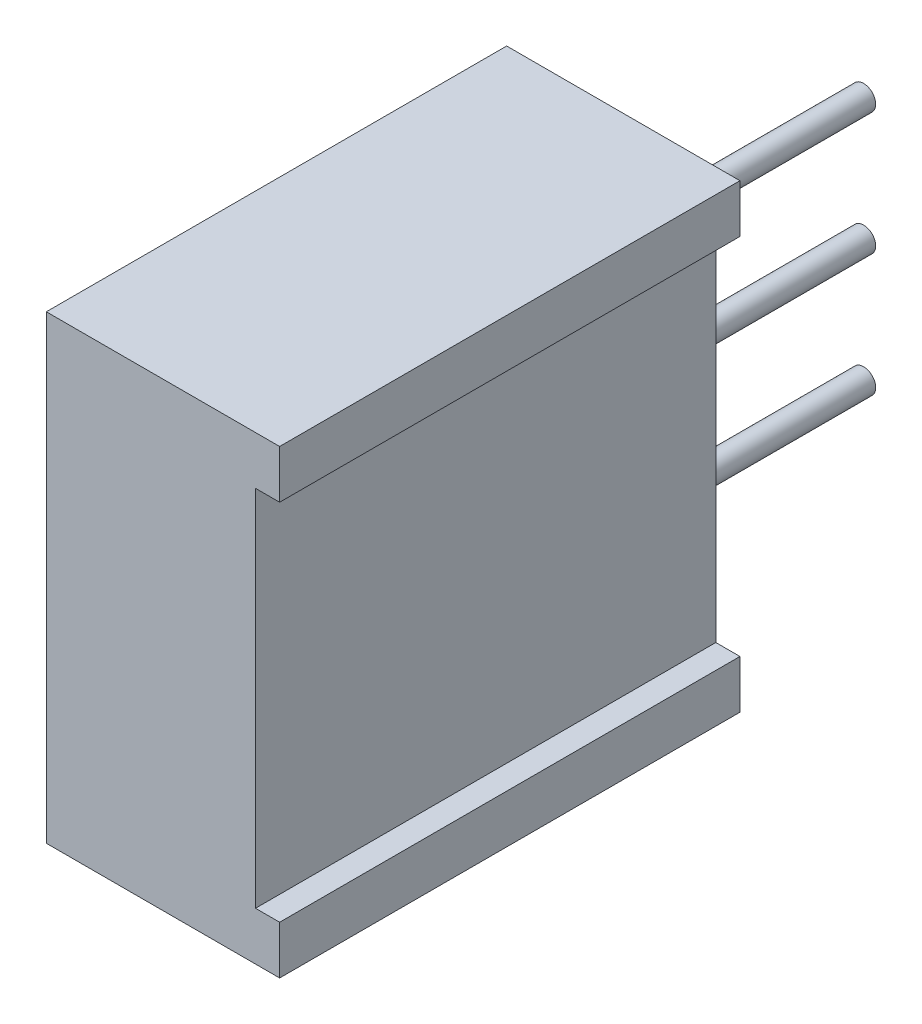
ISO-10303-21;
HEADER;
FILE_DESCRIPTION(('STEP AP214'),'2;1');
FILE_NAME('part.step','',(''),(''),'','','');
FILE_SCHEMA(('AUTOMOTIVE_DESIGN { 1 0 10303 214 1 1 1 1 }'));
ENDSEC;
DATA;
#1=APPLICATION_CONTEXT('core data for automotive mechanical design processes');
#2=APPLICATION_PROTOCOL_DEFINITION('international standard','automotive_design',2000,#1);
#3=PRODUCT_CONTEXT('',#1,'mechanical');
#4=PRODUCT('Part','Part','',(#3));
#5=PRODUCT_RELATED_PRODUCT_CATEGORY('part','',(#4));
#6=PRODUCT_DEFINITION_FORMATION('','',#4);
#7=PRODUCT_DEFINITION_CONTEXT('part definition',#1,'design');
#8=PRODUCT_DEFINITION('design','',#6,#7);
#9=PRODUCT_DEFINITION_SHAPE('','',#8);
#10=(LENGTH_UNIT() NAMED_UNIT(*) SI_UNIT(.MILLI.,.METRE.));
#11=(NAMED_UNIT(*) PLANE_ANGLE_UNIT() SI_UNIT($,.RADIAN.));
#12=(NAMED_UNIT(*) SI_UNIT($,.STERADIAN.) SOLID_ANGLE_UNIT());
#13=UNCERTAINTY_MEASURE_WITH_UNIT(LENGTH_MEASURE(1.E-05),#10,'distance_accuracy_value','');
#14=(GEOMETRIC_REPRESENTATION_CONTEXT(3) GLOBAL_UNCERTAINTY_ASSIGNED_CONTEXT((#13)) GLOBAL_UNIT_ASSIGNED_CONTEXT((#10,
#11,#12)) REPRESENTATION_CONTEXT('',''));
#15=CARTESIAN_POINT('',(0.,0.,0.));
#16=DIRECTION('',(0.,0.,1.));
#17=DIRECTION('',(1.,0.,0.));
#18=AXIS2_PLACEMENT_3D('',#15,#16,#17);
#19=CARTESIAN_POINT('',(4.83,0.,0.));
#20=DIRECTION('',(-1.,0.,0.));
#21=DIRECTION('',(0.,0.,1.));
#22=AXIS2_PLACEMENT_3D('',#19,#20,#21);
#23=PLANE('',#22);
#24=DIRECTION('',(0.,0.,1.));
#25=VECTOR('',#24,1.);
#26=CARTESIAN_POINT('',(4.83,-1.,0.));
#27=LINE('',#26,#25);
#28=CARTESIAN_POINT('',(4.83,-1.,0.));
#29=VERTEX_POINT('',#28);
#30=CARTESIAN_POINT('',(4.83,-1.,9.52999999999999));
#31=VERTEX_POINT('',#30);
#32=EDGE_CURVE('E45',#29,#31,#27,.T.);
#33=ORIENTED_EDGE('',*,*,#32,.F.);
#34=DIRECTION('',(0.,-1.,0.));
#35=VECTOR('',#34,1.);
#36=CARTESIAN_POINT('',(4.83,0.,0.));
#37=LINE('',#36,#35);
#38=CARTESIAN_POINT('',(4.83,0.,0.));
#39=VERTEX_POINT('',#38);
#40=EDGE_CURVE('E163',#39,#29,#37,.T.);
#41=ORIENTED_EDGE('',*,*,#40,.F.);
#42=DIRECTION('',(0.,0.,1.));
#43=VECTOR('',#42,1.);
#44=CARTESIAN_POINT('',(4.83,0.,0.));
#45=LINE('',#44,#43);
#46=CARTESIAN_POINT('',(4.83,0.,9.52999999999999));
#47=VERTEX_POINT('',#46);
#48=EDGE_CURVE('E128',#39,#47,#45,.T.);
#49=ORIENTED_EDGE('',*,*,#48,.T.);
#50=DIRECTION('',(0.,1.,0.));
#51=VECTOR('',#50,1.);
#52=CARTESIAN_POINT('',(4.83,-9.53,9.53));
#53=LINE('',#52,#51);
#54=EDGE_CURVE('E129',#31,#47,#53,.T.);
#55=ORIENTED_EDGE('',*,*,#54,.F.);
#56=EDGE_LOOP('',(#33,#41,#49,#55));
#57=FACE_BOUND('',#56,.T.);
#58=ADVANCED_FACE('F37',(#57),#23,.F.);
#59=CARTESIAN_POINT('',(4.83,0.,0.));
#60=DIRECTION('',(0.,0.,-1.));
#61=DIRECTION('',(-1.,0.,0.));
#62=AXIS2_PLACEMENT_3D('',#59,#60,#61);
#63=PLANE('',#62);
#64=DIRECTION('',(-1.,0.,0.));
#65=VECTOR('',#64,1.);
#66=CARTESIAN_POINT('',(4.83,-8.53,0.));
#67=LINE('',#66,#65);
#68=CARTESIAN_POINT('',(4.83,-8.53,0.));
#69=VERTEX_POINT('',#68);
#70=CARTESIAN_POINT('',(4.33,-8.53,0.));
#71=VERTEX_POINT('',#70);
#72=EDGE_CURVE('E192',#69,#71,#67,.T.);
#73=ORIENTED_EDGE('',*,*,#72,.F.);
#74=CARTESIAN_POINT('',(4.83,-9.53,0.));
#75=VERTEX_POINT('',#74);
#76=EDGE_CURVE('E86',#69,#75,#37,.T.);
#77=ORIENTED_EDGE('',*,*,#76,.T.);
#78=DIRECTION('',(-1.,0.,0.));
#79=VECTOR('',#78,1.);
#80=CARTESIAN_POINT('',(4.83,-9.53,0.));
#81=LINE('',#80,#79);
#82=CARTESIAN_POINT('',(0.,-9.53,0.));
#83=VERTEX_POINT('',#82);
#84=EDGE_CURVE('E132',#75,#83,#81,.T.);
#85=ORIENTED_EDGE('',*,*,#84,.T.);
#86=DIRECTION('',(0.,-1.,0.));
#87=VECTOR('',#86,1.);
#88=CARTESIAN_POINT('',(0.,0.,0.));
#89=LINE('',#88,#87);
#90=CARTESIAN_POINT('',(0.,0.,0.));
#91=VERTEX_POINT('',#90);
#92=EDGE_CURVE('E138',#91,#83,#89,.T.);
#93=ORIENTED_EDGE('',*,*,#92,.F.);
#94=DIRECTION('',(-1.,0.,0.));
#95=VECTOR('',#94,1.);
#96=CARTESIAN_POINT('',(4.83,0.,0.));
#97=LINE('',#96,#95);
#98=EDGE_CURVE('E61',#39,#91,#97,.T.);
#99=ORIENTED_EDGE('',*,*,#98,.F.);
#100=ORIENTED_EDGE('',*,*,#40,.T.);
#101=DIRECTION('',(-1.,0.,0.));
#102=VECTOR('',#101,1.);
#103=CARTESIAN_POINT('',(4.83,-1.,0.));
#104=LINE('',#103,#102);
#105=CARTESIAN_POINT('',(4.33,-1.,0.));
#106=VERTEX_POINT('',#105);
#107=EDGE_CURVE('E52',#29,#106,#104,.T.);
#108=ORIENTED_EDGE('',*,*,#107,.T.);
#109=DIRECTION('',(0.,-1.,0.));
#110=VECTOR('',#109,1.);
#111=CARTESIAN_POINT('',(4.33,0.,0.));
#112=LINE('',#111,#110);
#113=EDGE_CURVE('E187',#106,#71,#112,.T.);
#114=ORIENTED_EDGE('',*,*,#113,.T.);
#115=EDGE_LOOP('',(#73,#77,#85,#93,#99,#100,#108,#114));
#116=FACE_BOUND('',#115,.T.);
#117=CARTESIAN_POINT('',(2.39,-7.30500000000001,0.));
#118=DIRECTION('',(0.,0.,-1.));
#119=DIRECTION('',(-1.,0.,0.));
#120=AXIS2_PLACEMENT_3D('',#117,#118,#119);
#121=CIRCLE('',#120,0.25);
#122=CARTESIAN_POINT('',(2.14,-7.30500000000001,0.));
#123=VERTEX_POINT('',#122);
#124=EDGE_CURVE('E184',#123,#123,#121,.T.);
#125=ORIENTED_EDGE('',*,*,#124,.F.);
#126=EDGE_LOOP('',(#125));
#127=FACE_BOUND('',#126,.T.);
#128=CARTESIAN_POINT('',(2.39,-4.76500000000001,0.));
#129=DIRECTION('',(0.,0.,-1.));
#130=DIRECTION('',(-1.,0.,0.));
#131=AXIS2_PLACEMENT_3D('',#128,#129,#130);
#132=CIRCLE('',#131,0.25);
#133=CARTESIAN_POINT('',(2.14,-4.76500000000001,0.));
#134=VERTEX_POINT('',#133);
#135=EDGE_CURVE('E178',#134,#134,#132,.T.);
#136=ORIENTED_EDGE('',*,*,#135,.F.);
#137=EDGE_LOOP('',(#136));
#138=FACE_BOUND('',#137,.T.);
#139=CARTESIAN_POINT('',(2.39,-2.22500000000001,0.));
#140=DIRECTION('',(0.,0.,-1.));
#141=DIRECTION('',(-1.,0.,0.));
#142=AXIS2_PLACEMENT_3D('',#139,#140,#141);
#143=CIRCLE('',#142,0.25);
#144=CARTESIAN_POINT('',(2.14,-2.22500000000001,0.));
#145=VERTEX_POINT('',#144);
#146=EDGE_CURVE('E172',#145,#145,#143,.T.);
#147=ORIENTED_EDGE('',*,*,#146,.F.);
#148=EDGE_LOOP('',(#147));
#149=FACE_BOUND('',#148,.T.);
#150=ADVANCED_FACE('F39',(#116,#127,#138,#149),#63,.T.);
#151=CARTESIAN_POINT('',(4.83,0.,0.));
#152=DIRECTION('',(0.,-1.,0.));
#153=DIRECTION('',(0.,0.,-1.));
#154=AXIS2_PLACEMENT_3D('',#151,#152,#153);
#155=PLANE('',#154);
#156=DIRECTION('',(0.,0.,1.));
#157=VECTOR('',#156,1.);
#158=CARTESIAN_POINT('',(0.,0.,0.));
#159=LINE('',#158,#157);
#160=CARTESIAN_POINT('',(0.,0.,9.52999999999999));
#161=VERTEX_POINT('',#160);
#162=EDGE_CURVE('E148',#91,#161,#159,.T.);
#163=ORIENTED_EDGE('',*,*,#162,.T.);
#164=DIRECTION('',(-1.,0.,0.));
#165=VECTOR('',#164,1.);
#166=CARTESIAN_POINT('',(4.83,0.,9.52999999999999));
#167=LINE('',#166,#165);
#168=EDGE_CURVE('E151',#47,#161,#167,.T.);
#169=ORIENTED_EDGE('',*,*,#168,.F.);
#170=ORIENTED_EDGE('',*,*,#48,.F.);
#171=ORIENTED_EDGE('',*,*,#98,.T.);
#172=EDGE_LOOP('',(#163,#169,#170,#171));
#173=FACE_BOUND('',#172,.T.);
#174=ADVANCED_FACE('F164',(#173),#155,.F.);
#175=CARTESIAN_POINT('',(4.83,-9.53,9.53));
#176=DIRECTION('',(0.,0.,1.));
#177=DIRECTION('',(0.,-1.,0.));
#178=AXIS2_PLACEMENT_3D('',#175,#176,#177);
#179=PLANE('',#178);
#180=DIRECTION('',(1.,0.,0.));
#181=VECTOR('',#180,1.);
#182=CARTESIAN_POINT('',(4.33,-8.53,9.52999999999999));
#183=LINE('',#182,#181);
#184=CARTESIAN_POINT('',(4.33,-8.53,9.52999999999999));
#185=VERTEX_POINT('',#184);
#186=CARTESIAN_POINT('',(4.83,-8.53,9.52999999999999));
#187=VERTEX_POINT('',#186);
#188=EDGE_CURVE('E110',#185,#187,#183,.T.);
#189=ORIENTED_EDGE('',*,*,#188,.F.);
#190=DIRECTION('',(0.,1.,0.));
#191=VECTOR('',#190,1.);
#192=CARTESIAN_POINT('',(4.33,-8.53,9.52999999999999));
#193=LINE('',#192,#191);
#194=CARTESIAN_POINT('',(4.33,-1.,9.52999999999999));
#195=VERTEX_POINT('',#194);
#196=EDGE_CURVE('E160',#185,#195,#193,.T.);
#197=ORIENTED_EDGE('',*,*,#196,.T.);
#198=DIRECTION('',(1.,0.,0.));
#199=VECTOR('',#198,1.);
#200=CARTESIAN_POINT('',(4.33,-1.,9.52999999999999));
#201=LINE('',#200,#199);
#202=EDGE_CURVE('E118',#195,#31,#201,.T.);
#203=ORIENTED_EDGE('',*,*,#202,.T.);
#204=ORIENTED_EDGE('',*,*,#54,.T.);
#205=ORIENTED_EDGE('',*,*,#168,.T.);
#206=DIRECTION('',(0.,1.,0.));
#207=VECTOR('',#206,1.);
#208=CARTESIAN_POINT('',(0.,-9.53,9.53));
#209=LINE('',#208,#207);
#210=CARTESIAN_POINT('',(0.,-9.53,9.53));
#211=VERTEX_POINT('',#210);
#212=EDGE_CURVE('E145',#211,#161,#209,.T.);
#213=ORIENTED_EDGE('',*,*,#212,.F.);
#214=DIRECTION('',(-1.,0.,0.));
#215=VECTOR('',#214,1.);
#216=CARTESIAN_POINT('',(4.83,-9.53,9.53));
#217=LINE('',#216,#215);
#218=CARTESIAN_POINT('',(4.83,-9.53,9.53));
#219=VERTEX_POINT('',#218);
#220=EDGE_CURVE('E126',#219,#211,#217,.T.);
#221=ORIENTED_EDGE('',*,*,#220,.F.);
#222=EDGE_CURVE('E123',#219,#187,#53,.T.);
#223=ORIENTED_EDGE('',*,*,#222,.T.);
#224=EDGE_LOOP('',(#189,#197,#203,#204,#205,#213,#221,#223));
#225=FACE_BOUND('',#224,.T.);
#226=ADVANCED_FACE('F124',(#225),#179,.T.);
#227=CARTESIAN_POINT('',(4.83,-9.53,9.53));
#228=DIRECTION('',(0.,1.,0.));
#229=DIRECTION('',(0.,0.,1.));
#230=AXIS2_PLACEMENT_3D('',#227,#228,#229);
#231=PLANE('',#230);
#232=DIRECTION('',(0.,0.,-1.));
#233=VECTOR('',#232,1.);
#234=CARTESIAN_POINT('',(0.,-9.53,9.53));
#235=LINE('',#234,#233);
#236=EDGE_CURVE('E141',#211,#83,#235,.T.);
#237=ORIENTED_EDGE('',*,*,#236,.T.);
#238=ORIENTED_EDGE('',*,*,#84,.F.);
#239=DIRECTION('',(0.,0.,-1.));
#240=VECTOR('',#239,1.);
#241=CARTESIAN_POINT('',(4.83,-9.53,9.53));
#242=LINE('',#241,#240);
#243=EDGE_CURVE('E134',#219,#75,#242,.T.);
#244=ORIENTED_EDGE('',*,*,#243,.F.);
#245=ORIENTED_EDGE('',*,*,#220,.T.);
#246=EDGE_LOOP('',(#237,#238,#244,#245));
#247=FACE_BOUND('',#246,.T.);
#248=ADVANCED_FACE('F170',(#247),#231,.F.);
#249=ORIENTED_EDGE('',*,*,#76,.F.);
#250=DIRECTION('',(0.,0.,1.));
#251=VECTOR('',#250,1.);
#252=CARTESIAN_POINT('',(4.83,-8.53,0.));
#253=LINE('',#252,#251);
#254=EDGE_CURVE('E11',#69,#187,#253,.T.);
#255=ORIENTED_EDGE('',*,*,#254,.T.);
#256=ORIENTED_EDGE('',*,*,#222,.F.);
#257=ORIENTED_EDGE('',*,*,#243,.T.);
#258=EDGE_LOOP('',(#249,#255,#256,#257));
#259=FACE_BOUND('',#258,.T.);
#260=ADVANCED_FACE('F122',(#259),#23,.F.);
#261=CARTESIAN_POINT('',(0.,0.,0.));
#262=DIRECTION('',(-1.,0.,0.));
#263=DIRECTION('',(0.,0.,1.));
#264=AXIS2_PLACEMENT_3D('',#261,#262,#263);
#265=PLANE('',#264);
#266=ORIENTED_EDGE('',*,*,#92,.T.);
#267=ORIENTED_EDGE('',*,*,#236,.F.);
#268=ORIENTED_EDGE('',*,*,#212,.T.);
#269=ORIENTED_EDGE('',*,*,#162,.F.);
#270=EDGE_LOOP('',(#266,#267,#268,#269));
#271=FACE_BOUND('',#270,.T.);
#272=ADVANCED_FACE('F167',(#271),#265,.T.);
#273=CARTESIAN_POINT('',(2.39,-2.22500000000001,-5.));
#274=DIRECTION('',(0.,0.,1.));
#275=DIRECTION('',(1.,0.,0.));
#276=AXIS2_PLACEMENT_3D('',#273,#274,#275);
#277=CYLINDRICAL_SURFACE('',#276,0.25);
#278=CARTESIAN_POINT('',(2.39,-2.22500000000001,-5.));
#279=DIRECTION('',(0.,0.,-1.));
#280=DIRECTION('',(-1.,0.,0.));
#281=AXIS2_PLACEMENT_3D('',#278,#279,#280);
#282=CIRCLE('',#281,0.25);
#283=CARTESIAN_POINT('',(2.14,-2.22500000000001,-5.));
#284=VERTEX_POINT('',#283);
#285=EDGE_CURVE('E142',#284,#284,#282,.T.);
#286=ORIENTED_EDGE('',*,*,#285,.F.);
#287=EDGE_LOOP('',(#286));
#288=FACE_BOUND('',#287,.T.);
#289=ORIENTED_EDGE('',*,*,#146,.T.);
#290=EDGE_LOOP('',(#289));
#291=FACE_BOUND('',#290,.T.);
#292=ADVANCED_FACE('F208',(#288,#291),#277,.T.);
#293=CARTESIAN_POINT('',(2.39,-2.22500000000001,-5.));
#294=DIRECTION('',(0.,0.,-1.));
#295=DIRECTION('',(-1.,0.,0.));
#296=AXIS2_PLACEMENT_3D('',#293,#294,#295);
#297=PLANE('',#296);
#298=ORIENTED_EDGE('',*,*,#285,.T.);
#299=EDGE_LOOP('',(#298));
#300=FACE_BOUND('',#299,.T.);
#301=ADVANCED_FACE('F210',(#300),#297,.T.);
#302=CARTESIAN_POINT('',(2.39,-4.76500000000001,-5.));
#303=DIRECTION('',(0.,0.,1.));
#304=DIRECTION('',(1.,0.,0.));
#305=AXIS2_PLACEMENT_3D('',#302,#303,#304);
#306=CYLINDRICAL_SURFACE('',#305,0.25);
#307=CARTESIAN_POINT('',(2.39,-4.76500000000001,-5.));
#308=DIRECTION('',(0.,0.,-1.));
#309=DIRECTION('',(-1.,0.,0.));
#310=AXIS2_PLACEMENT_3D('',#307,#308,#309);
#311=CIRCLE('',#310,0.25);
#312=CARTESIAN_POINT('',(2.14,-4.76500000000001,-5.));
#313=VERTEX_POINT('',#312);
#314=EDGE_CURVE('E175',#313,#313,#311,.T.);
#315=ORIENTED_EDGE('',*,*,#314,.F.);
#316=EDGE_LOOP('',(#315));
#317=FACE_BOUND('',#316,.T.);
#318=ORIENTED_EDGE('',*,*,#135,.T.);
#319=EDGE_LOOP('',(#318));
#320=FACE_BOUND('',#319,.T.);
#321=ADVANCED_FACE('F217',(#317,#320),#306,.T.);
#322=CARTESIAN_POINT('',(2.39,-4.76500000000001,-5.));
#323=DIRECTION('',(0.,0.,-1.));
#324=DIRECTION('',(-1.,0.,0.));
#325=AXIS2_PLACEMENT_3D('',#322,#323,#324);
#326=PLANE('',#325);
#327=ORIENTED_EDGE('',*,*,#314,.T.);
#328=EDGE_LOOP('',(#327));
#329=FACE_BOUND('',#328,.T.);
#330=ADVANCED_FACE('F316',(#329),#326,.T.);
#331=CARTESIAN_POINT('',(2.39,-7.30500000000001,-5.));
#332=DIRECTION('',(0.,0.,1.));
#333=DIRECTION('',(1.,0.,0.));
#334=AXIS2_PLACEMENT_3D('',#331,#332,#333);
#335=CYLINDRICAL_SURFACE('',#334,0.25);
#336=CARTESIAN_POINT('',(2.39,-7.30500000000001,-5.));
#337=DIRECTION('',(0.,0.,-1.));
#338=DIRECTION('',(-1.,0.,0.));
#339=AXIS2_PLACEMENT_3D('',#336,#337,#338);
#340=CIRCLE('',#339,0.25);
#341=CARTESIAN_POINT('',(2.14,-7.30500000000001,-5.));
#342=VERTEX_POINT('',#341);
#343=EDGE_CURVE('E181',#342,#342,#340,.T.);
#344=ORIENTED_EDGE('',*,*,#343,.F.);
#345=EDGE_LOOP('',(#344));
#346=FACE_BOUND('',#345,.T.);
#347=ORIENTED_EDGE('',*,*,#124,.T.);
#348=EDGE_LOOP('',(#347));
#349=FACE_BOUND('',#348,.T.);
#350=ADVANCED_FACE('F326',(#346,#349),#335,.T.);
#351=CARTESIAN_POINT('',(2.39,-7.30500000000001,-5.));
#352=DIRECTION('',(0.,0.,-1.));
#353=DIRECTION('',(-1.,0.,0.));
#354=AXIS2_PLACEMENT_3D('',#351,#352,#353);
#355=PLANE('',#354);
#356=ORIENTED_EDGE('',*,*,#343,.T.);
#357=EDGE_LOOP('',(#356));
#358=FACE_BOUND('',#357,.T.);
#359=ADVANCED_FACE('F262',(#358),#355,.T.);
#360=CARTESIAN_POINT('',(4.33,-8.53,-5.));
#361=DIRECTION('',(0.,-1.,0.));
#362=DIRECTION('',(0.,0.,-1.));
#363=AXIS2_PLACEMENT_3D('',#360,#361,#362);
#364=PLANE('',#363);
#365=ORIENTED_EDGE('',*,*,#72,.T.);
#366=DIRECTION('',(0.,0.,1.));
#367=VECTOR('',#366,1.);
#368=CARTESIAN_POINT('',(4.33,-8.53,-5.));
#369=LINE('',#368,#367);
#370=EDGE_CURVE('E113',#71,#185,#369,.T.);
#371=ORIENTED_EDGE('',*,*,#370,.T.);
#372=ORIENTED_EDGE('',*,*,#188,.T.);
#373=ORIENTED_EDGE('',*,*,#254,.F.);
#374=EDGE_LOOP('',(#365,#371,#372,#373));
#375=FACE_BOUND('',#374,.T.);
#376=ADVANCED_FACE('F111',(#375),#364,.F.);
#377=CARTESIAN_POINT('',(4.33,-8.53,-5.));
#378=DIRECTION('',(1.,0.,0.));
#379=DIRECTION('',(0.,1.,0.));
#380=AXIS2_PLACEMENT_3D('',#377,#378,#379);
#381=PLANE('',#380);
#382=DIRECTION('',(0.,0.,1.));
#383=VECTOR('',#382,1.);
#384=CARTESIAN_POINT('',(4.33,-1.,-5.));
#385=LINE('',#384,#383);
#386=EDGE_CURVE('E195',#106,#195,#385,.T.);
#387=ORIENTED_EDGE('',*,*,#386,.T.);
#388=ORIENTED_EDGE('',*,*,#196,.F.);
#389=ORIENTED_EDGE('',*,*,#370,.F.);
#390=ORIENTED_EDGE('',*,*,#113,.F.);
#391=EDGE_LOOP('',(#387,#388,#389,#390));
#392=FACE_BOUND('',#391,.T.);
#393=ADVANCED_FACE('F199',(#392),#381,.T.);
#394=CARTESIAN_POINT('',(4.33,-1.,-5.));
#395=DIRECTION('',(0.,-1.,0.));
#396=DIRECTION('',(1.,0.,0.));
#397=AXIS2_PLACEMENT_3D('',#394,#395,#396);
#398=PLANE('',#397);
#399=ORIENTED_EDGE('',*,*,#32,.T.);
#400=ORIENTED_EDGE('',*,*,#202,.F.);
#401=ORIENTED_EDGE('',*,*,#386,.F.);
#402=ORIENTED_EDGE('',*,*,#107,.F.);
#403=EDGE_LOOP('',(#399,#400,#401,#402));
#404=FACE_BOUND('',#403,.T.);
#405=ADVANCED_FACE('F156',(#404),#398,.T.);
#406=CLOSED_SHELL('',(#58,#150,#174,#226,#248,#260,#272,#292,#301,#321,#330,#350,#359,#376,#393,#405));
#407=MANIFOLD_SOLID_BREP('B2',#406);
#408=ADVANCED_BREP_SHAPE_REPRESENTATION('',(#18,#407),#14);
#409=SHAPE_DEFINITION_REPRESENTATION(#9,#408);
ENDSEC;
END-ISO-10303-21;
